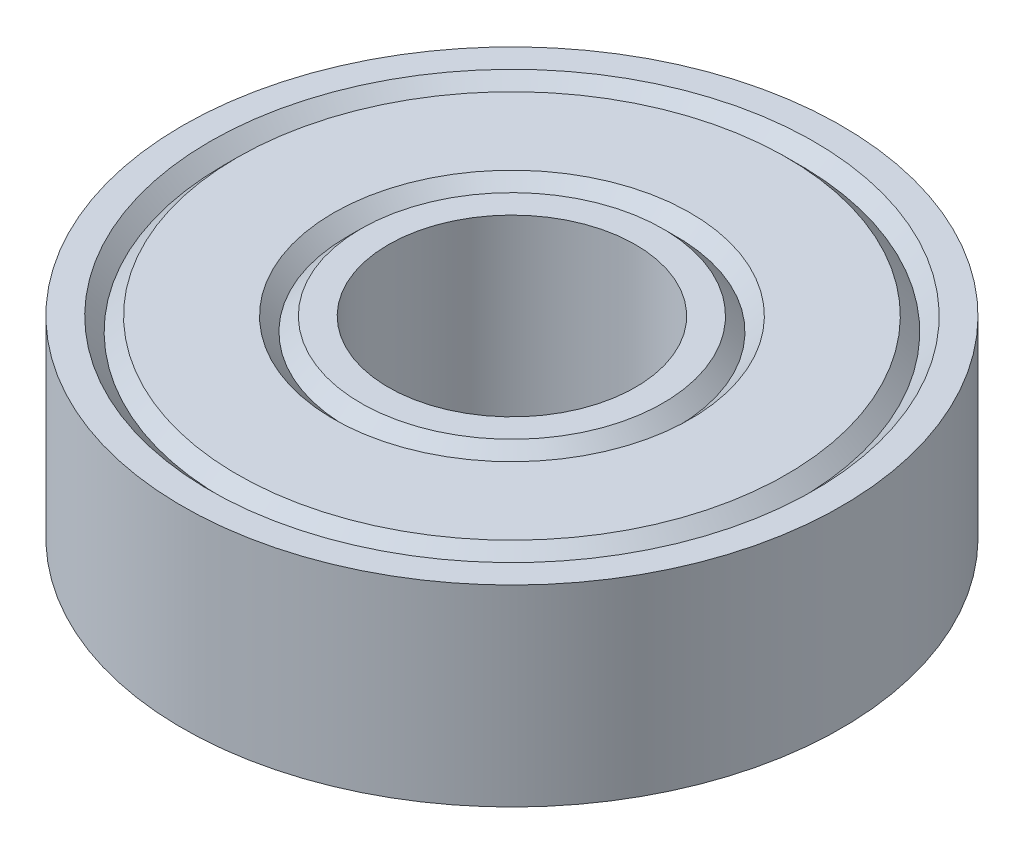
ISO-10303-21;
HEADER;
FILE_DESCRIPTION(('STEP AP214'),'2;1');
FILE_NAME('part.step','',(''),(''),'','','');
FILE_SCHEMA(('AUTOMOTIVE_DESIGN { 1 0 10303 214 1 1 1 1 }'));
ENDSEC;
DATA;
#1=APPLICATION_CONTEXT('core data for automotive mechanical design processes');
#2=APPLICATION_PROTOCOL_DEFINITION('international standard','automotive_design',2000,#1);
#3=PRODUCT_CONTEXT('',#1,'mechanical');
#4=PRODUCT('Part','Part','',(#3));
#5=PRODUCT_RELATED_PRODUCT_CATEGORY('part','',(#4));
#6=PRODUCT_DEFINITION_FORMATION('','',#4);
#7=PRODUCT_DEFINITION_CONTEXT('part definition',#1,'design');
#8=PRODUCT_DEFINITION('design','',#6,#7);
#9=PRODUCT_DEFINITION_SHAPE('','',#8);
#10=(LENGTH_UNIT() NAMED_UNIT(*) SI_UNIT(.MILLI.,.METRE.));
#11=(NAMED_UNIT(*) PLANE_ANGLE_UNIT() SI_UNIT($,.RADIAN.));
#12=(NAMED_UNIT(*) SI_UNIT($,.STERADIAN.) SOLID_ANGLE_UNIT());
#13=UNCERTAINTY_MEASURE_WITH_UNIT(LENGTH_MEASURE(1.E-05),#10,'distance_accuracy_value','');
#14=(GEOMETRIC_REPRESENTATION_CONTEXT(3) GLOBAL_UNCERTAINTY_ASSIGNED_CONTEXT((#13)) GLOBAL_UNIT_ASSIGNED_CONTEXT((#10,
#11,#12)) REPRESENTATION_CONTEXT('',''));
#15=CARTESIAN_POINT('',(0.,0.,0.));
#16=DIRECTION('',(0.,0.,1.));
#17=DIRECTION('',(1.,0.,0.));
#18=AXIS2_PLACEMENT_3D('',#15,#16,#17);
#19=CARTESIAN_POINT('',(0.,3.5,0.));
#20=DIRECTION('',(0.,1.,0.));
#21=DIRECTION('',(-1.,0.,0.));
#22=AXIS2_PLACEMENT_3D('',#19,#20,#21);
#23=CYLINDRICAL_SURFACE('',#22,4.5);
#24=CARTESIAN_POINT('',(0.,3.5,0.));
#25=DIRECTION('',(0.,1.,0.));
#26=DIRECTION('',(-1.,0.,0.));
#27=AXIS2_PLACEMENT_3D('',#24,#25,#26);
#28=CIRCLE('',#27,4.5);
#29=CARTESIAN_POINT('',(-4.5,3.5,0.));
#30=VERTEX_POINT('',#29);
#31=EDGE_CURVE('E83',#30,#30,#28,.T.);
#32=ORIENTED_EDGE('',*,*,#31,.T.);
#33=EDGE_LOOP('',(#32));
#34=FACE_BOUND('',#33,.T.);
#35=CARTESIAN_POINT('',(0.,-3.50000000000001,0.));
#36=DIRECTION('',(0.,1.,0.));
#37=DIRECTION('',(-1.,0.,0.));
#38=AXIS2_PLACEMENT_3D('',#35,#36,#37);
#39=CIRCLE('',#38,4.5);
#40=CARTESIAN_POINT('',(-4.5,-3.5,0.));
#41=VERTEX_POINT('',#40);
#42=EDGE_CURVE('E10',#41,#41,#39,.T.);
#43=ORIENTED_EDGE('',*,*,#42,.F.);
#44=EDGE_LOOP('',(#43));
#45=FACE_BOUND('',#44,.T.);
#46=ADVANCED_FACE('F31',(#34,#45),#23,.F.);
#47=CARTESIAN_POINT('',(-4.5,-3.5,0.));
#48=DIRECTION('',(0.,-1.,0.));
#49=DIRECTION('',(1.,0.,0.));
#50=AXIS2_PLACEMENT_3D('',#47,#48,#49);
#51=PLANE('',#50);
#52=ORIENTED_EDGE('',*,*,#42,.T.);
#53=EDGE_LOOP('',(#52));
#54=FACE_BOUND('',#53,.T.);
#55=CARTESIAN_POINT('',(0.,-3.5,0.));
#56=DIRECTION('',(0.,1.,0.));
#57=DIRECTION('',(-1.,0.,0.));
#58=AXIS2_PLACEMENT_3D('',#55,#56,#57);
#59=CIRCLE('',#58,5.5);
#60=CARTESIAN_POINT('',(-5.5,-3.5,0.));
#61=VERTEX_POINT('',#60);
#62=EDGE_CURVE('E37',#61,#61,#59,.T.);
#63=ORIENTED_EDGE('',*,*,#62,.F.);
#64=EDGE_LOOP('',(#63));
#65=FACE_BOUND('',#64,.T.);
#66=ADVANCED_FACE('F101',(#54,#65),#51,.T.);
#67=CARTESIAN_POINT('',(0.,-3.,0.));
#68=DIRECTION('',(0.,1.,0.));
#69=DIRECTION('',(-1.,0.,0.));
#70=AXIS2_PLACEMENT_3D('',#67,#68,#69);
#71=CONICAL_SURFACE('',#70,6.,0.78539816339745);
#72=ORIENTED_EDGE('',*,*,#62,.T.);
#73=EDGE_LOOP('',(#72));
#74=FACE_BOUND('',#73,.T.);
#75=CARTESIAN_POINT('',(0.,-3.,0.));
#76=DIRECTION('',(0.,1.,0.));
#77=DIRECTION('',(-1.,0.,0.));
#78=AXIS2_PLACEMENT_3D('',#75,#76,#77);
#79=CIRCLE('',#78,6.);
#80=CARTESIAN_POINT('',(-6.,-3.,0.));
#81=VERTEX_POINT('',#80);
#82=EDGE_CURVE('E41',#81,#81,#79,.T.);
#83=ORIENTED_EDGE('',*,*,#82,.F.);
#84=EDGE_LOOP('',(#83));
#85=FACE_BOUND('',#84,.T.);
#86=ADVANCED_FACE('F105',(#74,#85),#71,.T.);
#87=CARTESIAN_POINT('',(0.,-3.5,0.));
#88=DIRECTION('',(0.,-1.,0.));
#89=DIRECTION('',(1.,0.,0.));
#90=AXIS2_PLACEMENT_3D('',#87,#88,#89);
#91=CONICAL_SURFACE('',#90,6.5,0.785398163397447);
#92=ORIENTED_EDGE('',*,*,#82,.T.);
#93=EDGE_LOOP('',(#92));
#94=FACE_BOUND('',#93,.T.);
#95=CARTESIAN_POINT('',(0.,-3.5,0.));
#96=DIRECTION('',(0.,1.,0.));
#97=DIRECTION('',(-1.,0.,0.));
#98=AXIS2_PLACEMENT_3D('',#95,#96,#97);
#99=CIRCLE('',#98,6.5);
#100=CARTESIAN_POINT('',(-6.5,-3.5,0.));
#101=VERTEX_POINT('',#100);
#102=EDGE_CURVE('E45',#101,#101,#99,.T.);
#103=ORIENTED_EDGE('',*,*,#102,.F.);
#104=EDGE_LOOP('',(#103));
#105=FACE_BOUND('',#104,.T.);
#106=ADVANCED_FACE('F109',(#94,#105),#91,.F.);
#107=CARTESIAN_POINT('',(-6.5,-3.5,0.));
#108=DIRECTION('',(0.,-1.,0.));
#109=DIRECTION('',(1.,0.,0.));
#110=AXIS2_PLACEMENT_3D('',#107,#108,#109);
#111=PLANE('',#110);
#112=ORIENTED_EDGE('',*,*,#102,.T.);
#113=EDGE_LOOP('',(#112));
#114=FACE_BOUND('',#113,.T.);
#115=CARTESIAN_POINT('',(0.,-3.5,0.));
#116=DIRECTION('',(0.,1.,0.));
#117=DIRECTION('',(-1.,0.,0.));
#118=AXIS2_PLACEMENT_3D('',#115,#116,#117);
#119=CIRCLE('',#118,10.);
#120=CARTESIAN_POINT('',(-10.,-3.5,0.));
#121=VERTEX_POINT('',#120);
#122=EDGE_CURVE('E50',#121,#121,#119,.T.);
#123=ORIENTED_EDGE('',*,*,#122,.F.);
#124=EDGE_LOOP('',(#123));
#125=FACE_BOUND('',#124,.T.);
#126=ADVANCED_FACE('F115',(#114,#125),#111,.T.);
#127=CARTESIAN_POINT('',(0.,-3.,0.));
#128=DIRECTION('',(0.,1.,0.));
#129=DIRECTION('',(-1.,0.,0.));
#130=AXIS2_PLACEMENT_3D('',#127,#128,#129);
#131=CONICAL_SURFACE('',#130,10.5,0.785398163397447);
#132=ORIENTED_EDGE('',*,*,#122,.T.);
#133=EDGE_LOOP('',(#132));
#134=FACE_BOUND('',#133,.T.);
#135=CARTESIAN_POINT('',(0.,-3.,0.));
#136=DIRECTION('',(0.,1.,0.));
#137=DIRECTION('',(-1.,0.,0.));
#138=AXIS2_PLACEMENT_3D('',#135,#136,#137);
#139=CIRCLE('',#138,10.5);
#140=CARTESIAN_POINT('',(-10.5,-3.,0.));
#141=VERTEX_POINT('',#140);
#142=EDGE_CURVE('E53',#141,#141,#139,.T.);
#143=ORIENTED_EDGE('',*,*,#142,.F.);
#144=EDGE_LOOP('',(#143));
#145=FACE_BOUND('',#144,.T.);
#146=ADVANCED_FACE('F119',(#134,#145),#131,.T.);
#147=CARTESIAN_POINT('',(0.,-3.5,0.));
#148=DIRECTION('',(0.,-1.,0.));
#149=DIRECTION('',(1.,0.,0.));
#150=AXIS2_PLACEMENT_3D('',#147,#148,#149);
#151=CONICAL_SURFACE('',#150,11.,0.785398163397447);
#152=ORIENTED_EDGE('',*,*,#142,.T.);
#153=EDGE_LOOP('',(#152));
#154=FACE_BOUND('',#153,.T.);
#155=CARTESIAN_POINT('',(0.,-3.5,0.));
#156=DIRECTION('',(0.,1.,0.));
#157=DIRECTION('',(-1.,0.,0.));
#158=AXIS2_PLACEMENT_3D('',#155,#156,#157);
#159=CIRCLE('',#158,11.);
#160=CARTESIAN_POINT('',(-11.,-3.5,0.));
#161=VERTEX_POINT('',#160);
#162=EDGE_CURVE('E56',#161,#161,#159,.T.);
#163=ORIENTED_EDGE('',*,*,#162,.F.);
#164=EDGE_LOOP('',(#163));
#165=FACE_BOUND('',#164,.T.);
#166=ADVANCED_FACE('F123',(#154,#165),#151,.F.);
#167=CARTESIAN_POINT('',(-11.,-3.5,0.));
#168=DIRECTION('',(0.,-1.,0.));
#169=DIRECTION('',(1.,0.,0.));
#170=AXIS2_PLACEMENT_3D('',#167,#168,#169);
#171=PLANE('',#170);
#172=ORIENTED_EDGE('',*,*,#162,.T.);
#173=EDGE_LOOP('',(#172));
#174=FACE_BOUND('',#173,.T.);
#175=CARTESIAN_POINT('',(0.,-3.5,0.));
#176=DIRECTION('',(0.,1.,0.));
#177=DIRECTION('',(-1.,0.,0.));
#178=AXIS2_PLACEMENT_3D('',#175,#176,#177);
#179=CIRCLE('',#178,12.);
#180=CARTESIAN_POINT('',(-12.,-3.5,0.));
#181=VERTEX_POINT('',#180);
#182=EDGE_CURVE('E59',#181,#181,#179,.T.);
#183=ORIENTED_EDGE('',*,*,#182,.F.);
#184=EDGE_LOOP('',(#183));
#185=FACE_BOUND('',#184,.T.);
#186=ADVANCED_FACE('F127',(#174,#185),#171,.T.);
#187=CARTESIAN_POINT('',(0.,3.5,0.));
#188=DIRECTION('',(0.,1.,0.));
#189=DIRECTION('',(-1.,0.,0.));
#190=AXIS2_PLACEMENT_3D('',#187,#188,#189);
#191=CYLINDRICAL_SURFACE('',#190,12.);
#192=ORIENTED_EDGE('',*,*,#182,.T.);
#193=EDGE_LOOP('',(#192));
#194=FACE_BOUND('',#193,.T.);
#195=CARTESIAN_POINT('',(0.,3.5,0.));
#196=DIRECTION('',(0.,1.,0.));
#197=DIRECTION('',(-1.,0.,0.));
#198=AXIS2_PLACEMENT_3D('',#195,#196,#197);
#199=CIRCLE('',#198,12.);
#200=CARTESIAN_POINT('',(-12.,3.5,0.));
#201=VERTEX_POINT('',#200);
#202=EDGE_CURVE('E62',#201,#201,#199,.T.);
#203=ORIENTED_EDGE('',*,*,#202,.F.);
#204=EDGE_LOOP('',(#203));
#205=FACE_BOUND('',#204,.T.);
#206=ADVANCED_FACE('F131',(#194,#205),#191,.T.);
#207=CARTESIAN_POINT('',(-11.,3.5,0.));
#208=DIRECTION('',(0.,1.,0.));
#209=DIRECTION('',(-1.,0.,0.));
#210=AXIS2_PLACEMENT_3D('',#207,#208,#209);
#211=PLANE('',#210);
#212=ORIENTED_EDGE('',*,*,#202,.T.);
#213=EDGE_LOOP('',(#212));
#214=FACE_BOUND('',#213,.T.);
#215=CARTESIAN_POINT('',(0.,3.5,0.));
#216=DIRECTION('',(0.,1.,0.));
#217=DIRECTION('',(-1.,0.,0.));
#218=AXIS2_PLACEMENT_3D('',#215,#216,#217);
#219=CIRCLE('',#218,11.);
#220=CARTESIAN_POINT('',(-11.,3.5,0.));
#221=VERTEX_POINT('',#220);
#222=EDGE_CURVE('E65',#221,#221,#219,.T.);
#223=ORIENTED_EDGE('',*,*,#222,.F.);
#224=EDGE_LOOP('',(#223));
#225=FACE_BOUND('',#224,.T.);
#226=ADVANCED_FACE('F135',(#214,#225),#211,.T.);
#227=CARTESIAN_POINT('',(0.,3.,0.));
#228=DIRECTION('',(0.,1.,0.));
#229=DIRECTION('',(-1.,0.,0.));
#230=AXIS2_PLACEMENT_3D('',#227,#228,#229);
#231=CONICAL_SURFACE('',#230,10.5,0.785398163397448);
#232=ORIENTED_EDGE('',*,*,#222,.T.);
#233=EDGE_LOOP('',(#232));
#234=FACE_BOUND('',#233,.T.);
#235=CARTESIAN_POINT('',(0.,3.,0.));
#236=DIRECTION('',(0.,1.,0.));
#237=DIRECTION('',(-1.,0.,0.));
#238=AXIS2_PLACEMENT_3D('',#235,#236,#237);
#239=CIRCLE('',#238,10.5);
#240=CARTESIAN_POINT('',(-10.5,3.,0.));
#241=VERTEX_POINT('',#240);
#242=EDGE_CURVE('E68',#241,#241,#239,.T.);
#243=ORIENTED_EDGE('',*,*,#242,.F.);
#244=EDGE_LOOP('',(#243));
#245=FACE_BOUND('',#244,.T.);
#246=ADVANCED_FACE('F139',(#234,#245),#231,.F.);
#247=CARTESIAN_POINT('',(0.,3.5,0.));
#248=DIRECTION('',(0.,-1.,0.));
#249=DIRECTION('',(1.,0.,0.));
#250=AXIS2_PLACEMENT_3D('',#247,#248,#249);
#251=CONICAL_SURFACE('',#250,10.,0.785398163397448);
#252=ORIENTED_EDGE('',*,*,#242,.T.);
#253=EDGE_LOOP('',(#252));
#254=FACE_BOUND('',#253,.T.);
#255=CARTESIAN_POINT('',(0.,3.5,0.));
#256=DIRECTION('',(0.,1.,0.));
#257=DIRECTION('',(-1.,0.,0.));
#258=AXIS2_PLACEMENT_3D('',#255,#256,#257);
#259=CIRCLE('',#258,10.);
#260=CARTESIAN_POINT('',(-10.,3.5,0.));
#261=VERTEX_POINT('',#260);
#262=EDGE_CURVE('E71',#261,#261,#259,.T.);
#263=ORIENTED_EDGE('',*,*,#262,.F.);
#264=EDGE_LOOP('',(#263));
#265=FACE_BOUND('',#264,.T.);
#266=ADVANCED_FACE('F143',(#254,#265),#251,.T.);
#267=CARTESIAN_POINT('',(-6.5,3.5,0.));
#268=DIRECTION('',(0.,1.,0.));
#269=DIRECTION('',(-1.,0.,0.));
#270=AXIS2_PLACEMENT_3D('',#267,#268,#269);
#271=PLANE('',#270);
#272=ORIENTED_EDGE('',*,*,#262,.T.);
#273=EDGE_LOOP('',(#272));
#274=FACE_BOUND('',#273,.T.);
#275=CARTESIAN_POINT('',(0.,3.5,0.));
#276=DIRECTION('',(0.,1.,0.));
#277=DIRECTION('',(-1.,0.,0.));
#278=AXIS2_PLACEMENT_3D('',#275,#276,#277);
#279=CIRCLE('',#278,6.5);
#280=CARTESIAN_POINT('',(-6.5,3.5,0.));
#281=VERTEX_POINT('',#280);
#282=EDGE_CURVE('E74',#281,#281,#279,.T.);
#283=ORIENTED_EDGE('',*,*,#282,.F.);
#284=EDGE_LOOP('',(#283));
#285=FACE_BOUND('',#284,.T.);
#286=ADVANCED_FACE('F147',(#274,#285),#271,.T.);
#287=CARTESIAN_POINT('',(0.,3.,0.));
#288=DIRECTION('',(0.,1.,0.));
#289=DIRECTION('',(-1.,0.,0.));
#290=AXIS2_PLACEMENT_3D('',#287,#288,#289);
#291=CONICAL_SURFACE('',#290,6.,0.785398163397448);
#292=ORIENTED_EDGE('',*,*,#282,.T.);
#293=EDGE_LOOP('',(#292));
#294=FACE_BOUND('',#293,.T.);
#295=CARTESIAN_POINT('',(0.,3.,0.));
#296=DIRECTION('',(0.,1.,0.));
#297=DIRECTION('',(-1.,0.,0.));
#298=AXIS2_PLACEMENT_3D('',#295,#296,#297);
#299=CIRCLE('',#298,6.);
#300=CARTESIAN_POINT('',(-6.,3.,0.));
#301=VERTEX_POINT('',#300);
#302=EDGE_CURVE('E77',#301,#301,#299,.T.);
#303=ORIENTED_EDGE('',*,*,#302,.F.);
#304=EDGE_LOOP('',(#303));
#305=FACE_BOUND('',#304,.T.);
#306=ADVANCED_FACE('F97',(#294,#305),#291,.F.);
#307=CARTESIAN_POINT('',(0.,3.5,0.));
#308=DIRECTION('',(0.,-1.,0.));
#309=DIRECTION('',(1.,0.,0.));
#310=AXIS2_PLACEMENT_3D('',#307,#308,#309);
#311=CONICAL_SURFACE('',#310,5.5,0.785398163397448);
#312=ORIENTED_EDGE('',*,*,#302,.T.);
#313=EDGE_LOOP('',(#312));
#314=FACE_BOUND('',#313,.T.);
#315=CARTESIAN_POINT('',(0.,3.5,0.));
#316=DIRECTION('',(0.,1.,0.));
#317=DIRECTION('',(-1.,0.,0.));
#318=AXIS2_PLACEMENT_3D('',#315,#316,#317);
#319=CIRCLE('',#318,5.5);
#320=CARTESIAN_POINT('',(-5.5,3.5,0.));
#321=VERTEX_POINT('',#320);
#322=EDGE_CURVE('E80',#321,#321,#319,.T.);
#323=ORIENTED_EDGE('',*,*,#322,.F.);
#324=EDGE_LOOP('',(#323));
#325=FACE_BOUND('',#324,.T.);
#326=ADVANCED_FACE('F91',(#314,#325),#311,.T.);
#327=CARTESIAN_POINT('',(-4.5,3.5,0.));
#328=DIRECTION('',(0.,1.,0.));
#329=DIRECTION('',(-1.,0.,0.));
#330=AXIS2_PLACEMENT_3D('',#327,#328,#329);
#331=PLANE('',#330);
#332=ORIENTED_EDGE('',*,*,#322,.T.);
#333=EDGE_LOOP('',(#332));
#334=FACE_BOUND('',#333,.T.);
#335=ORIENTED_EDGE('',*,*,#31,.F.);
#336=EDGE_LOOP('',(#335));
#337=FACE_BOUND('',#336,.T.);
#338=ADVANCED_FACE('F89',(#334,#337),#331,.T.);
#339=CLOSED_SHELL('',(#46,#66,#86,#106,#126,#146,#166,#186,#206,#226,#246,#266,#286,#306,#326,#338));
#340=MANIFOLD_SOLID_BREP('B2',#339);
#341=ADVANCED_BREP_SHAPE_REPRESENTATION('',(#18,#340),#14);
#342=SHAPE_DEFINITION_REPRESENTATION(#9,#341);
ENDSEC;
END-ISO-10303-21;
